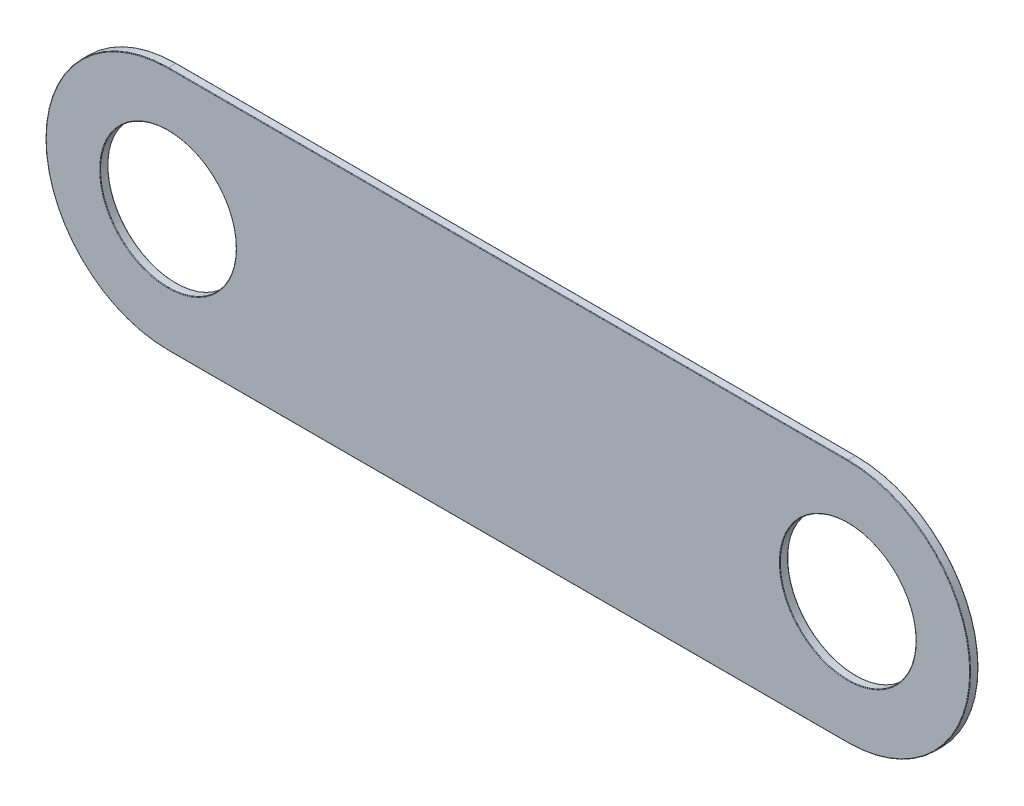
ISO-10303-21;
HEADER;
FILE_DESCRIPTION(('STEP AP214'),'2;1');
FILE_NAME('part.step','',(''),(''),'','','');
FILE_SCHEMA(('AUTOMOTIVE_DESIGN { 1 0 10303 214 1 1 1 1 }'));
ENDSEC;
DATA;
#1=APPLICATION_CONTEXT('core data for automotive mechanical design processes');
#2=APPLICATION_PROTOCOL_DEFINITION('international standard','automotive_design',2000,#1);
#3=PRODUCT_CONTEXT('',#1,'mechanical');
#4=PRODUCT('Part','Part','',(#3));
#5=PRODUCT_RELATED_PRODUCT_CATEGORY('part','',(#4));
#6=PRODUCT_DEFINITION_FORMATION('','',#4);
#7=PRODUCT_DEFINITION_CONTEXT('part definition',#1,'design');
#8=PRODUCT_DEFINITION('design','',#6,#7);
#9=PRODUCT_DEFINITION_SHAPE('','',#8);
#10=(LENGTH_UNIT() NAMED_UNIT(*) SI_UNIT(.MILLI.,.METRE.));
#11=(NAMED_UNIT(*) PLANE_ANGLE_UNIT() SI_UNIT($,.RADIAN.));
#12=(NAMED_UNIT(*) SI_UNIT($,.STERADIAN.) SOLID_ANGLE_UNIT());
#13=UNCERTAINTY_MEASURE_WITH_UNIT(LENGTH_MEASURE(1.E-05),#10,'distance_accuracy_value','');
#14=(GEOMETRIC_REPRESENTATION_CONTEXT(3) GLOBAL_UNCERTAINTY_ASSIGNED_CONTEXT((#13)) GLOBAL_UNIT_ASSIGNED_CONTEXT((#10,
#11,#12)) REPRESENTATION_CONTEXT('',''));
#15=CARTESIAN_POINT('',(0.,0.,0.));
#16=DIRECTION('',(0.,0.,1.));
#17=DIRECTION('',(1.,0.,0.));
#18=AXIS2_PLACEMENT_3D('',#15,#16,#17);
#19=CARTESIAN_POINT('',(-6.25,0.,-0.15));
#20=DIRECTION('',(0.,0.,1.));
#21=DIRECTION('',(1.,0.,0.));
#22=AXIS2_PLACEMENT_3D('',#19,#20,#21);
#23=CYLINDRICAL_SURFACE('',#22,2.25);
#24=DIRECTION('',(0.,0.,1.));
#25=VECTOR('',#24,1.);
#26=CARTESIAN_POINT('',(-6.25,2.25,-0.15));
#27=LINE('',#26,#25);
#28=CARTESIAN_POINT('',(-6.25,2.25,-0.14));
#29=VERTEX_POINT('',#28);
#30=CARTESIAN_POINT('',(-6.25,2.25,-0.01));
#31=VERTEX_POINT('',#30);
#32=EDGE_CURVE('E108',#29,#31,#27,.T.);
#33=ORIENTED_EDGE('',*,*,#32,.F.);
#34=CARTESIAN_POINT('',(-6.25,0.,-0.14));
#35=DIRECTION('',(0.,0.,1.));
#36=DIRECTION('',(1.,0.,0.));
#37=AXIS2_PLACEMENT_3D('',#34,#35,#36);
#38=CIRCLE('',#37,2.25);
#39=CARTESIAN_POINT('',(-6.25,-2.25,-0.14));
#40=VERTEX_POINT('',#39);
#41=EDGE_CURVE('E103',#29,#40,#38,.T.);
#42=ORIENTED_EDGE('',*,*,#41,.T.);
#43=DIRECTION('',(0.,0.,1.));
#44=VECTOR('',#43,1.);
#45=CARTESIAN_POINT('',(-6.25,-2.25,-0.15));
#46=LINE('',#45,#44);
#47=CARTESIAN_POINT('',(-6.25,-2.25,-0.01));
#48=VERTEX_POINT('',#47);
#49=EDGE_CURVE('E105',#40,#48,#46,.T.);
#50=ORIENTED_EDGE('',*,*,#49,.T.);
#51=CARTESIAN_POINT('',(-6.25,0.,-0.01));
#52=DIRECTION('',(0.,0.,1.));
#53=DIRECTION('',(1.,0.,0.));
#54=AXIS2_PLACEMENT_3D('',#51,#52,#53);
#55=CIRCLE('',#54,2.25);
#56=EDGE_CURVE('E114',#48,#31,#55,.F.);
#57=ORIENTED_EDGE('',*,*,#56,.T.);
#58=EDGE_LOOP('',(#33,#42,#50,#57));
#59=FACE_BOUND('',#58,.T.);
#60=ADVANCED_FACE('F37',(#59),#23,.T.);
#61=CARTESIAN_POINT('',(-6.25,2.25,-0.15));
#62=DIRECTION('',(0.,1.,0.));
#63=DIRECTION('',(-1.,0.,0.));
#64=AXIS2_PLACEMENT_3D('',#61,#62,#63);
#65=PLANE('',#64);
#66=DIRECTION('',(0.,0.,1.));
#67=VECTOR('',#66,1.);
#68=CARTESIAN_POINT('',(6.25,2.25,-0.15));
#69=LINE('',#68,#67);
#70=CARTESIAN_POINT('',(6.25,2.25,-0.14));
#71=VERTEX_POINT('',#70);
#72=CARTESIAN_POINT('',(6.25,2.25,-0.01));
#73=VERTEX_POINT('',#72);
#74=EDGE_CURVE('E214',#71,#73,#69,.T.);
#75=ORIENTED_EDGE('',*,*,#74,.F.);
#76=DIRECTION('',(-1.,0.,0.));
#77=VECTOR('',#76,1.);
#78=CARTESIAN_POINT('',(-6.25,2.25,-0.14));
#79=LINE('',#78,#77);
#80=EDGE_CURVE('E164',#71,#29,#79,.T.);
#81=ORIENTED_EDGE('',*,*,#80,.T.);
#82=ORIENTED_EDGE('',*,*,#32,.T.);
#83=DIRECTION('',(-1.,0.,0.));
#84=VECTOR('',#83,1.);
#85=CARTESIAN_POINT('',(-6.25,2.25,-0.01));
#86=LINE('',#85,#84);
#87=EDGE_CURVE('E161',#31,#73,#86,.F.);
#88=ORIENTED_EDGE('',*,*,#87,.T.);
#89=EDGE_LOOP('',(#75,#81,#82,#88));
#90=FACE_BOUND('',#89,.T.);
#91=ADVANCED_FACE('F211',(#90),#65,.T.);
#92=CARTESIAN_POINT('',(6.25,0.,-0.15));
#93=DIRECTION('',(0.,0.,1.));
#94=DIRECTION('',(1.,0.,0.));
#95=AXIS2_PLACEMENT_3D('',#92,#93,#94);
#96=CYLINDRICAL_SURFACE('',#95,2.25);
#97=DIRECTION('',(0.,0.,1.));
#98=VECTOR('',#97,1.);
#99=CARTESIAN_POINT('',(6.25,-2.25,-0.15));
#100=LINE('',#99,#98);
#101=CARTESIAN_POINT('',(6.25,-2.25,-0.14));
#102=VERTEX_POINT('',#101);
#103=CARTESIAN_POINT('',(6.25,-2.25,-0.01));
#104=VERTEX_POINT('',#103);
#105=EDGE_CURVE('E125',#102,#104,#100,.T.);
#106=ORIENTED_EDGE('',*,*,#105,.F.);
#107=CARTESIAN_POINT('',(6.25,0.,-0.14));
#108=DIRECTION('',(0.,0.,1.));
#109=DIRECTION('',(1.,0.,0.));
#110=AXIS2_PLACEMENT_3D('',#107,#108,#109);
#111=CIRCLE('',#110,2.25);
#112=EDGE_CURVE('E159',#102,#71,#111,.T.);
#113=ORIENTED_EDGE('',*,*,#112,.T.);
#114=ORIENTED_EDGE('',*,*,#74,.T.);
#115=CARTESIAN_POINT('',(6.25,0.,-0.01));
#116=DIRECTION('',(0.,0.,1.));
#117=DIRECTION('',(1.,0.,0.));
#118=AXIS2_PLACEMENT_3D('',#115,#116,#117);
#119=CIRCLE('',#118,2.25);
#120=EDGE_CURVE('E157',#73,#104,#119,.F.);
#121=ORIENTED_EDGE('',*,*,#120,.T.);
#122=EDGE_LOOP('',(#106,#113,#114,#121));
#123=FACE_BOUND('',#122,.T.);
#124=ADVANCED_FACE('F252',(#123),#96,.T.);
#125=CARTESIAN_POINT('',(-6.25,-2.25,-0.15));
#126=DIRECTION('',(0.,-1.,0.));
#127=DIRECTION('',(1.,0.,0.));
#128=AXIS2_PLACEMENT_3D('',#125,#126,#127);
#129=PLANE('',#128);
#130=ORIENTED_EDGE('',*,*,#49,.F.);
#131=DIRECTION('',(1.,0.,0.));
#132=VECTOR('',#131,1.);
#133=CARTESIAN_POINT('',(6.25,-2.25,-0.14));
#134=LINE('',#133,#132);
#135=EDGE_CURVE('E121',#40,#102,#134,.T.);
#136=ORIENTED_EDGE('',*,*,#135,.T.);
#137=ORIENTED_EDGE('',*,*,#105,.T.);
#138=DIRECTION('',(1.,0.,0.));
#139=VECTOR('',#138,1.);
#140=CARTESIAN_POINT('',(-6.25,-2.25,-0.01));
#141=LINE('',#140,#139);
#142=EDGE_CURVE('E124',#104,#48,#141,.F.);
#143=ORIENTED_EDGE('',*,*,#142,.T.);
#144=EDGE_LOOP('',(#130,#136,#137,#143));
#145=FACE_BOUND('',#144,.T.);
#146=ADVANCED_FACE('F118',(#145),#129,.T.);
#147=CARTESIAN_POINT('',(-6.25,0.,-0.15));
#148=DIRECTION('',(0.,0.,1.));
#149=DIRECTION('',(1.,0.,0.));
#150=AXIS2_PLACEMENT_3D('',#147,#148,#149);
#151=PLANE('',#150);
#152=CARTESIAN_POINT('',(6.25,0.,-0.15));
#153=DIRECTION('',(0.,0.,1.));
#154=DIRECTION('',(1.,0.,0.));
#155=AXIS2_PLACEMENT_3D('',#152,#153,#154);
#156=CIRCLE('',#155,2.24);
#157=CARTESIAN_POINT('',(6.25,2.24,-0.15));
#158=VERTEX_POINT('',#157);
#159=CARTESIAN_POINT('',(6.25,-2.24,-0.15));
#160=VERTEX_POINT('',#159);
#161=EDGE_CURVE('E153',#158,#160,#156,.F.);
#162=ORIENTED_EDGE('',*,*,#161,.T.);
#163=DIRECTION('',(1.,0.,0.));
#164=VECTOR('',#163,1.);
#165=CARTESIAN_POINT('',(-6.25,-2.24,-0.15));
#166=LINE('',#165,#164);
#167=CARTESIAN_POINT('',(-6.25,-2.24,-0.15));
#168=VERTEX_POINT('',#167);
#169=EDGE_CURVE('E155',#160,#168,#166,.F.);
#170=ORIENTED_EDGE('',*,*,#169,.T.);
#171=CARTESIAN_POINT('',(-6.25,0.,-0.15));
#172=DIRECTION('',(0.,0.,1.));
#173=DIRECTION('',(1.,0.,0.));
#174=AXIS2_PLACEMENT_3D('',#171,#172,#173);
#175=CIRCLE('',#174,2.24);
#176=CARTESIAN_POINT('',(-6.25,2.24,-0.15));
#177=VERTEX_POINT('',#176);
#178=EDGE_CURVE('E131',#168,#177,#175,.F.);
#179=ORIENTED_EDGE('',*,*,#178,.T.);
#180=DIRECTION('',(-1.,0.,0.));
#181=VECTOR('',#180,1.);
#182=CARTESIAN_POINT('',(6.25,2.24,-0.15));
#183=LINE('',#182,#181);
#184=EDGE_CURVE('E151',#177,#158,#183,.F.);
#185=ORIENTED_EDGE('',*,*,#184,.T.);
#186=EDGE_LOOP('',(#162,#170,#179,#185));
#187=FACE_BOUND('',#186,.T.);
#188=CARTESIAN_POINT('',(-6.25,0.,-0.15));
#189=DIRECTION('',(0.,0.,1.));
#190=DIRECTION('',(1.,0.,0.));
#191=AXIS2_PLACEMENT_3D('',#188,#189,#190);
#192=CIRCLE('',#191,1.26);
#193=CARTESIAN_POINT('',(-4.99,0.,-0.15));
#194=VERTEX_POINT('',#193);
#195=EDGE_CURVE('E144',#194,#194,#192,.T.);
#196=ORIENTED_EDGE('',*,*,#195,.T.);
#197=EDGE_LOOP('',(#196));
#198=FACE_BOUND('',#197,.T.);
#199=CARTESIAN_POINT('',(6.25,0.,-0.15));
#200=DIRECTION('',(0.,0.,1.));
#201=DIRECTION('',(1.,0.,0.));
#202=AXIS2_PLACEMENT_3D('',#199,#200,#201);
#203=CIRCLE('',#202,1.26);
#204=CARTESIAN_POINT('',(7.51,0.,-0.15));
#205=VERTEX_POINT('',#204);
#206=EDGE_CURVE('E141',#205,#205,#203,.T.);
#207=ORIENTED_EDGE('',*,*,#206,.T.);
#208=EDGE_LOOP('',(#207));
#209=FACE_BOUND('',#208,.T.);
#210=ADVANCED_FACE('F223',(#187,#198,#209),#151,.F.);
#211=CARTESIAN_POINT('',(-6.25,0.,0.));
#212=DIRECTION('',(0.,0.,1.));
#213=DIRECTION('',(1.,0.,0.));
#214=AXIS2_PLACEMENT_3D('',#211,#212,#213);
#215=PLANE('',#214);
#216=CARTESIAN_POINT('',(6.25,0.,0.));
#217=DIRECTION('',(0.,0.,1.));
#218=DIRECTION('',(1.,0.,0.));
#219=AXIS2_PLACEMENT_3D('',#216,#217,#218);
#220=CIRCLE('',#219,2.24);
#221=CARTESIAN_POINT('',(6.25,-2.24,0.));
#222=VERTEX_POINT('',#221);
#223=CARTESIAN_POINT('',(6.25,2.24,0.));
#224=VERTEX_POINT('',#223);
#225=EDGE_CURVE('E46',#222,#224,#220,.T.);
#226=ORIENTED_EDGE('',*,*,#225,.T.);
#227=DIRECTION('',(-1.,0.,0.));
#228=VECTOR('',#227,1.);
#229=CARTESIAN_POINT('',(-6.25,2.24,0.));
#230=LINE('',#229,#228);
#231=CARTESIAN_POINT('',(-6.25,2.24,0.));
#232=VERTEX_POINT('',#231);
#233=EDGE_CURVE('E11',#224,#232,#230,.T.);
#234=ORIENTED_EDGE('',*,*,#233,.T.);
#235=CARTESIAN_POINT('',(-6.25,0.,0.));
#236=DIRECTION('',(0.,0.,1.));
#237=DIRECTION('',(1.,0.,0.));
#238=AXIS2_PLACEMENT_3D('',#235,#236,#237);
#239=CIRCLE('',#238,2.24);
#240=CARTESIAN_POINT('',(-6.25,-2.24,0.));
#241=VERTEX_POINT('',#240);
#242=EDGE_CURVE('E184',#232,#241,#239,.T.);
#243=ORIENTED_EDGE('',*,*,#242,.T.);
#244=DIRECTION('',(1.,0.,0.));
#245=VECTOR('',#244,1.);
#246=CARTESIAN_POINT('',(-6.25,-2.24,0.));
#247=LINE('',#246,#245);
#248=EDGE_CURVE('E57',#241,#222,#247,.T.);
#249=ORIENTED_EDGE('',*,*,#248,.T.);
#250=EDGE_LOOP('',(#226,#234,#243,#249));
#251=FACE_BOUND('',#250,.T.);
#252=CARTESIAN_POINT('',(-6.25,0.,0.));
#253=DIRECTION('',(0.,0.,1.));
#254=DIRECTION('',(1.,0.,0.));
#255=AXIS2_PLACEMENT_3D('',#252,#253,#254);
#256=CIRCLE('',#255,1.26);
#257=CARTESIAN_POINT('',(-4.99,0.,0.));
#258=VERTEX_POINT('',#257);
#259=EDGE_CURVE('E181',#258,#258,#256,.F.);
#260=ORIENTED_EDGE('',*,*,#259,.T.);
#261=EDGE_LOOP('',(#260));
#262=FACE_BOUND('',#261,.T.);
#263=CARTESIAN_POINT('',(6.25,0.,0.));
#264=DIRECTION('',(0.,0.,1.));
#265=DIRECTION('',(1.,0.,0.));
#266=AXIS2_PLACEMENT_3D('',#263,#264,#265);
#267=CIRCLE('',#266,1.26);
#268=CARTESIAN_POINT('',(7.51,0.,0.));
#269=VERTEX_POINT('',#268);
#270=EDGE_CURVE('E178',#269,#269,#267,.F.);
#271=ORIENTED_EDGE('',*,*,#270,.T.);
#272=EDGE_LOOP('',(#271));
#273=FACE_BOUND('',#272,.T.);
#274=ADVANCED_FACE('F219',(#251,#262,#273),#215,.T.);
#275=CARTESIAN_POINT('',(-6.25,0.,-0.15));
#276=DIRECTION('',(0.,0.,1.));
#277=DIRECTION('',(1.,0.,0.));
#278=AXIS2_PLACEMENT_3D('',#275,#276,#277);
#279=CYLINDRICAL_SURFACE('',#278,1.25);
#280=CARTESIAN_POINT('',(-6.25,0.,-0.14));
#281=DIRECTION('',(0.,0.,1.));
#282=DIRECTION('',(1.,0.,0.));
#283=AXIS2_PLACEMENT_3D('',#280,#281,#282);
#284=CIRCLE('',#283,1.25);
#285=CARTESIAN_POINT('',(-5.,0.,-0.14));
#286=VERTEX_POINT('',#285);
#287=EDGE_CURVE('E169',#286,#286,#284,.F.);
#288=ORIENTED_EDGE('',*,*,#287,.T.);
#289=EDGE_LOOP('',(#288));
#290=FACE_BOUND('',#289,.T.);
#291=CARTESIAN_POINT('',(-6.25,0.,-0.01));
#292=DIRECTION('',(0.,0.,1.));
#293=DIRECTION('',(1.,0.,0.));
#294=AXIS2_PLACEMENT_3D('',#291,#292,#293);
#295=CIRCLE('',#294,1.25);
#296=CARTESIAN_POINT('',(-5.,0.,-0.01));
#297=VERTEX_POINT('',#296);
#298=EDGE_CURVE('E113',#297,#297,#295,.T.);
#299=ORIENTED_EDGE('',*,*,#298,.T.);
#300=EDGE_LOOP('',(#299));
#301=FACE_BOUND('',#300,.T.);
#302=ADVANCED_FACE('F222',(#290,#301),#279,.F.);
#303=CARTESIAN_POINT('',(6.25,0.,-0.15));
#304=DIRECTION('',(0.,0.,1.));
#305=DIRECTION('',(1.,0.,0.));
#306=AXIS2_PLACEMENT_3D('',#303,#304,#305);
#307=CYLINDRICAL_SURFACE('',#306,1.25);
#308=CARTESIAN_POINT('',(6.25,0.,-0.14));
#309=DIRECTION('',(0.,0.,1.));
#310=DIRECTION('',(1.,0.,0.));
#311=AXIS2_PLACEMENT_3D('',#308,#309,#310);
#312=CIRCLE('',#311,1.25);
#313=CARTESIAN_POINT('',(7.5,0.,-0.14));
#314=VERTEX_POINT('',#313);
#315=EDGE_CURVE('E175',#314,#314,#312,.F.);
#316=ORIENTED_EDGE('',*,*,#315,.T.);
#317=EDGE_LOOP('',(#316));
#318=FACE_BOUND('',#317,.T.);
#319=CARTESIAN_POINT('',(6.25,0.,-0.01));
#320=DIRECTION('',(0.,0.,1.));
#321=DIRECTION('',(1.,0.,0.));
#322=AXIS2_PLACEMENT_3D('',#319,#320,#321);
#323=CIRCLE('',#322,1.25);
#324=CARTESIAN_POINT('',(7.5,0.,-0.01));
#325=VERTEX_POINT('',#324);
#326=EDGE_CURVE('E172',#325,#325,#323,.T.);
#327=ORIENTED_EDGE('',*,*,#326,.T.);
#328=EDGE_LOOP('',(#327));
#329=FACE_BOUND('',#328,.T.);
#330=ADVANCED_FACE('F234',(#318,#329),#307,.F.);
#331=CARTESIAN_POINT('',(-6.25,2.24,-0.14));
#332=DIRECTION('',(1.,0.,0.));
#333=DIRECTION('',(0.,1.,0.));
#334=AXIS2_PLACEMENT_3D('',#331,#332,#333);
#335=CYLINDRICAL_SURFACE('',#334,0.01);
#336=CARTESIAN_POINT('',(6.25,2.24,-0.14));
#337=DIRECTION('',(1.,0.,0.));
#338=DIRECTION('',(0.,0.,-1.));
#339=AXIS2_PLACEMENT_3D('',#336,#337,#338);
#340=CIRCLE('',#339,0.01);
#341=EDGE_CURVE('E135',#158,#71,#340,.T.);
#342=ORIENTED_EDGE('',*,*,#341,.F.);
#343=ORIENTED_EDGE('',*,*,#184,.F.);
#344=CARTESIAN_POINT('',(-6.25,2.24,-0.14));
#345=DIRECTION('',(-1.,0.,0.));
#346=DIRECTION('',(0.,0.,1.));
#347=AXIS2_PLACEMENT_3D('',#344,#345,#346);
#348=CIRCLE('',#347,0.01);
#349=EDGE_CURVE('E126',#29,#177,#348,.T.);
#350=ORIENTED_EDGE('',*,*,#349,.F.);
#351=ORIENTED_EDGE('',*,*,#80,.F.);
#352=EDGE_LOOP('',(#342,#343,#350,#351));
#353=FACE_BOUND('',#352,.T.);
#354=ADVANCED_FACE('F236',(#353),#335,.T.);
#355=CARTESIAN_POINT('',(-6.25,0.,-0.14));
#356=DIRECTION('',(0.,0.,1.));
#357=DIRECTION('',(1.,0.,0.));
#358=AXIS2_PLACEMENT_3D('',#355,#356,#357);
#359=TOROIDAL_SURFACE('',#358,2.24,0.01);
#360=ORIENTED_EDGE('',*,*,#349,.T.);
#361=ORIENTED_EDGE('',*,*,#178,.F.);
#362=CARTESIAN_POINT('',(-6.25,-2.24,-0.14));
#363=DIRECTION('',(1.,0.,0.));
#364=DIRECTION('',(0.,0.,-1.));
#365=AXIS2_PLACEMENT_3D('',#362,#363,#364);
#366=CIRCLE('',#365,0.01);
#367=EDGE_CURVE('E129',#40,#168,#366,.T.);
#368=ORIENTED_EDGE('',*,*,#367,.F.);
#369=ORIENTED_EDGE('',*,*,#41,.F.);
#370=EDGE_LOOP('',(#360,#361,#368,#369));
#371=FACE_BOUND('',#370,.T.);
#372=ADVANCED_FACE('F130',(#371),#359,.T.);
#373=CARTESIAN_POINT('',(6.25,0.,-0.14));
#374=DIRECTION('',(0.,0.,1.));
#375=DIRECTION('',(1.,0.,0.));
#376=AXIS2_PLACEMENT_3D('',#373,#374,#375);
#377=TOROIDAL_SURFACE('',#376,2.24,0.01);
#378=ORIENTED_EDGE('',*,*,#341,.T.);
#379=ORIENTED_EDGE('',*,*,#112,.F.);
#380=CARTESIAN_POINT('',(6.25,-2.24,-0.14));
#381=DIRECTION('',(-1.,0.,0.));
#382=DIRECTION('',(0.,0.,1.));
#383=AXIS2_PLACEMENT_3D('',#380,#381,#382);
#384=CIRCLE('',#383,0.01);
#385=EDGE_CURVE('E136',#160,#102,#384,.T.);
#386=ORIENTED_EDGE('',*,*,#385,.F.);
#387=ORIENTED_EDGE('',*,*,#161,.F.);
#388=EDGE_LOOP('',(#378,#379,#386,#387));
#389=FACE_BOUND('',#388,.T.);
#390=ADVANCED_FACE('F260',(#389),#377,.T.);
#391=CARTESIAN_POINT('',(-6.25,-2.24,-0.14));
#392=DIRECTION('',(-1.,0.,0.));
#393=DIRECTION('',(0.,-1.,0.));
#394=AXIS2_PLACEMENT_3D('',#391,#392,#393);
#395=CYLINDRICAL_SURFACE('',#394,0.01);
#396=ORIENTED_EDGE('',*,*,#367,.T.);
#397=ORIENTED_EDGE('',*,*,#169,.F.);
#398=ORIENTED_EDGE('',*,*,#385,.T.);
#399=ORIENTED_EDGE('',*,*,#135,.F.);
#400=EDGE_LOOP('',(#396,#397,#398,#399));
#401=FACE_BOUND('',#400,.T.);
#402=ADVANCED_FACE('F138',(#401),#395,.T.);
#403=CARTESIAN_POINT('',(-6.25,0.,-0.14));
#404=DIRECTION('',(0.,0.,1.));
#405=DIRECTION('',(1.,0.,0.));
#406=AXIS2_PLACEMENT_3D('',#403,#404,#405);
#407=TOROIDAL_SURFACE('',#406,1.26,0.01);
#408=ORIENTED_EDGE('',*,*,#287,.F.);
#409=EDGE_LOOP('',(#408));
#410=FACE_BOUND('',#409,.T.);
#411=ORIENTED_EDGE('',*,*,#195,.F.);
#412=EDGE_LOOP('',(#411));
#413=FACE_BOUND('',#412,.T.);
#414=ADVANCED_FACE('F259',(#410,#413),#407,.T.);
#415=CARTESIAN_POINT('',(6.25,0.,-0.14));
#416=DIRECTION('',(0.,0.,1.));
#417=DIRECTION('',(1.,0.,0.));
#418=AXIS2_PLACEMENT_3D('',#415,#416,#417);
#419=TOROIDAL_SURFACE('',#418,1.26,0.01);
#420=ORIENTED_EDGE('',*,*,#315,.F.);
#421=EDGE_LOOP('',(#420));
#422=FACE_BOUND('',#421,.T.);
#423=ORIENTED_EDGE('',*,*,#206,.F.);
#424=EDGE_LOOP('',(#423));
#425=FACE_BOUND('',#424,.T.);
#426=ADVANCED_FACE('F268',(#422,#425),#419,.T.);
#427=CARTESIAN_POINT('',(-6.25,-2.24,-0.01));
#428=DIRECTION('',(1.,0.,0.));
#429=DIRECTION('',(0.,1.,0.));
#430=AXIS2_PLACEMENT_3D('',#427,#428,#429);
#431=CYLINDRICAL_SURFACE('',#430,0.01);
#432=CARTESIAN_POINT('',(-6.25,-2.24,-0.01));
#433=DIRECTION('',(-1.,0.,0.));
#434=DIRECTION('',(0.,0.,1.));
#435=AXIS2_PLACEMENT_3D('',#432,#433,#434);
#436=CIRCLE('',#435,0.01);
#437=EDGE_CURVE('E195',#48,#241,#436,.T.);
#438=ORIENTED_EDGE('',*,*,#437,.F.);
#439=ORIENTED_EDGE('',*,*,#142,.F.);
#440=CARTESIAN_POINT('',(6.25,-2.24,-0.01));
#441=DIRECTION('',(1.,0.,0.));
#442=DIRECTION('',(0.,0.,-1.));
#443=AXIS2_PLACEMENT_3D('',#440,#441,#442);
#444=CIRCLE('',#443,0.01);
#445=EDGE_CURVE('E41',#222,#104,#444,.T.);
#446=ORIENTED_EDGE('',*,*,#445,.F.);
#447=ORIENTED_EDGE('',*,*,#248,.F.);
#448=EDGE_LOOP('',(#438,#439,#446,#447));
#449=FACE_BOUND('',#448,.T.);
#450=ADVANCED_FACE('F205',(#449),#431,.T.);
#451=CARTESIAN_POINT('',(6.25,0.,-0.01));
#452=DIRECTION('',(0.,0.,1.));
#453=DIRECTION('',(1.,0.,0.));
#454=AXIS2_PLACEMENT_3D('',#451,#452,#453);
#455=TOROIDAL_SURFACE('',#454,2.24,0.01);
#456=ORIENTED_EDGE('',*,*,#445,.T.);
#457=ORIENTED_EDGE('',*,*,#120,.F.);
#458=CARTESIAN_POINT('',(6.25,2.24,-0.01));
#459=DIRECTION('',(-1.,0.,0.));
#460=DIRECTION('',(0.,0.,1.));
#461=AXIS2_PLACEMENT_3D('',#458,#459,#460);
#462=CIRCLE('',#461,0.01);
#463=EDGE_CURVE('E194',#224,#73,#462,.T.);
#464=ORIENTED_EDGE('',*,*,#463,.F.);
#465=ORIENTED_EDGE('',*,*,#225,.F.);
#466=EDGE_LOOP('',(#456,#457,#464,#465));
#467=FACE_BOUND('',#466,.T.);
#468=ADVANCED_FACE('F203',(#467),#455,.T.);
#469=CARTESIAN_POINT('',(-6.25,0.,-0.01));
#470=DIRECTION('',(0.,0.,1.));
#471=DIRECTION('',(1.,0.,0.));
#472=AXIS2_PLACEMENT_3D('',#469,#470,#471);
#473=TOROIDAL_SURFACE('',#472,2.24,0.01);
#474=ORIENTED_EDGE('',*,*,#437,.T.);
#475=ORIENTED_EDGE('',*,*,#242,.F.);
#476=CARTESIAN_POINT('',(-6.25,2.24,-0.01));
#477=DIRECTION('',(1.,0.,0.));
#478=DIRECTION('',(0.,0.,-1.));
#479=AXIS2_PLACEMENT_3D('',#476,#477,#478);
#480=CIRCLE('',#479,0.01);
#481=EDGE_CURVE('E192',#31,#232,#480,.T.);
#482=ORIENTED_EDGE('',*,*,#481,.F.);
#483=ORIENTED_EDGE('',*,*,#56,.F.);
#484=EDGE_LOOP('',(#474,#475,#482,#483));
#485=FACE_BOUND('',#484,.T.);
#486=ADVANCED_FACE('F207',(#485),#473,.T.);
#487=CARTESIAN_POINT('',(-6.25,2.24,-0.01));
#488=DIRECTION('',(-1.,0.,0.));
#489=DIRECTION('',(0.,-1.,0.));
#490=AXIS2_PLACEMENT_3D('',#487,#488,#489);
#491=CYLINDRICAL_SURFACE('',#490,0.01);
#492=ORIENTED_EDGE('',*,*,#463,.T.);
#493=ORIENTED_EDGE('',*,*,#87,.F.);
#494=ORIENTED_EDGE('',*,*,#481,.T.);
#495=ORIENTED_EDGE('',*,*,#233,.F.);
#496=EDGE_LOOP('',(#492,#493,#494,#495));
#497=FACE_BOUND('',#496,.T.);
#498=ADVANCED_FACE('F217',(#497),#491,.T.);
#499=CARTESIAN_POINT('',(-6.25,0.,-0.01));
#500=DIRECTION('',(0.,0.,1.));
#501=DIRECTION('',(1.,0.,0.));
#502=AXIS2_PLACEMENT_3D('',#499,#500,#501);
#503=TOROIDAL_SURFACE('',#502,1.26,0.01);
#504=ORIENTED_EDGE('',*,*,#259,.F.);
#505=EDGE_LOOP('',(#504));
#506=FACE_BOUND('',#505,.T.);
#507=ORIENTED_EDGE('',*,*,#298,.F.);
#508=EDGE_LOOP('',(#507));
#509=FACE_BOUND('',#508,.T.);
#510=ADVANCED_FACE('F231',(#506,#509),#503,.T.);
#511=CARTESIAN_POINT('',(6.25,0.,-0.01));
#512=DIRECTION('',(0.,0.,1.));
#513=DIRECTION('',(1.,0.,0.));
#514=AXIS2_PLACEMENT_3D('',#511,#512,#513);
#515=TOROIDAL_SURFACE('',#514,1.26,0.01);
#516=ORIENTED_EDGE('',*,*,#270,.F.);
#517=EDGE_LOOP('',(#516));
#518=FACE_BOUND('',#517,.T.);
#519=ORIENTED_EDGE('',*,*,#326,.F.);
#520=EDGE_LOOP('',(#519));
#521=FACE_BOUND('',#520,.T.);
#522=ADVANCED_FACE('F39',(#518,#521),#515,.T.);
#523=CLOSED_SHELL('',(#60,#91,#124,#146,#210,#274,#302,#330,#354,#372,#390,#402,#414,#426,#450,
#468,#486,#498,#510,#522));
#524=MANIFOLD_SOLID_BREP('B2',#523);
#525=ADVANCED_BREP_SHAPE_REPRESENTATION('',(#18,#524),#14);
#526=SHAPE_DEFINITION_REPRESENTATION(#9,#525);
ENDSEC;
END-ISO-10303-21;
